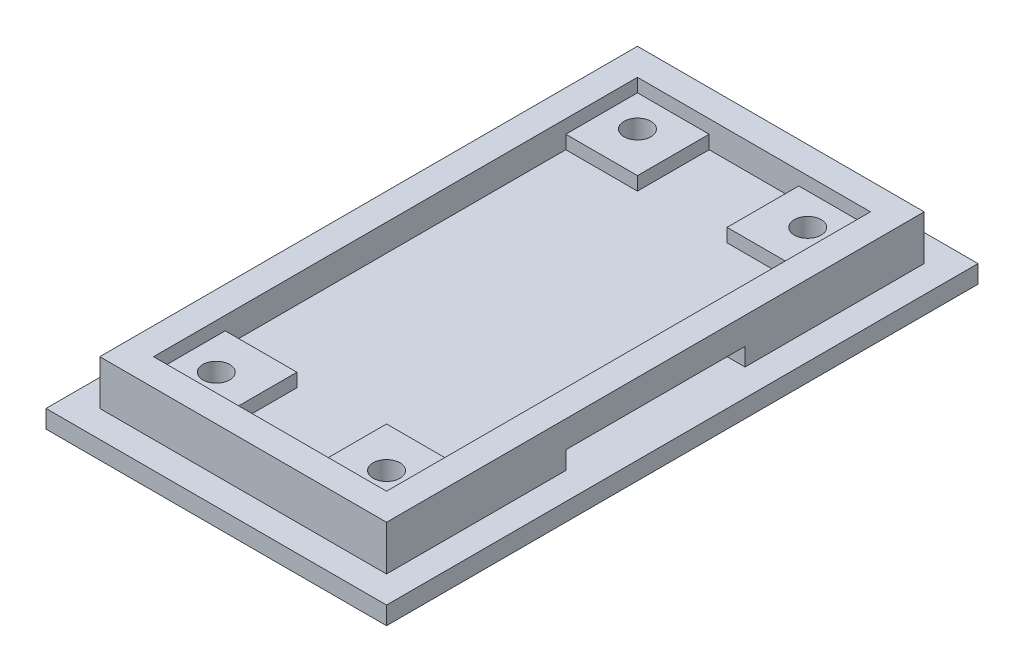
ISO-10303-21;
HEADER;
FILE_DESCRIPTION(('STEP AP214'),'2;1');
FILE_NAME('part.step','',(''),(''),'','','');
FILE_SCHEMA(('AUTOMOTIVE_DESIGN { 1 0 10303 214 1 1 1 1 }'));
ENDSEC;
DATA;
#1=APPLICATION_CONTEXT('core data for automotive mechanical design processes');
#2=APPLICATION_PROTOCOL_DEFINITION('international standard','automotive_design',2000,#1);
#3=PRODUCT_CONTEXT('',#1,'mechanical');
#4=PRODUCT('Part','Part','',(#3));
#5=PRODUCT_RELATED_PRODUCT_CATEGORY('part','',(#4));
#6=PRODUCT_DEFINITION_FORMATION('','',#4);
#7=PRODUCT_DEFINITION_CONTEXT('part definition',#1,'design');
#8=PRODUCT_DEFINITION('design','',#6,#7);
#9=PRODUCT_DEFINITION_SHAPE('','',#8);
#10=(LENGTH_UNIT() NAMED_UNIT(*) SI_UNIT(.MILLI.,.METRE.));
#11=(NAMED_UNIT(*) PLANE_ANGLE_UNIT() SI_UNIT($,.RADIAN.));
#12=(NAMED_UNIT(*) SI_UNIT($,.STERADIAN.) SOLID_ANGLE_UNIT());
#13=UNCERTAINTY_MEASURE_WITH_UNIT(LENGTH_MEASURE(1.E-05),#10,'distance_accuracy_value','');
#14=(GEOMETRIC_REPRESENTATION_CONTEXT(3) GLOBAL_UNCERTAINTY_ASSIGNED_CONTEXT((#13)) GLOBAL_UNIT_ASSIGNED_CONTEXT((#10,
#11,#12)) REPRESENTATION_CONTEXT('',''));
#15=CARTESIAN_POINT('',(0.,0.,0.));
#16=DIRECTION('',(0.,0.,1.));
#17=DIRECTION('',(1.,0.,0.));
#18=AXIS2_PLACEMENT_3D('',#15,#16,#17);
#19=CARTESIAN_POINT('',(0.,2.,0.));
#20=DIRECTION('',(0.,1.,0.));
#21=DIRECTION('',(0.,0.,1.));
#22=AXIS2_PLACEMENT_3D('',#19,#20,#21);
#23=PLANE('',#22);
#24=DIRECTION('',(-1.,0.,0.));
#25=VECTOR('',#24,1.);
#26=CARTESIAN_POINT('',(-4.99999999999821,2.,19.));
#27=LINE('',#26,#25);
#28=CARTESIAN_POINT('',(-4.99999999999821,2.,19.));
#29=VERTEX_POINT('',#28);
#30=CARTESIAN_POINT('',(-12.9999999999982,2.,19.));
#31=VERTEX_POINT('',#30);
#32=EDGE_CURVE('E305',#29,#31,#27,.T.);
#33=ORIENTED_EDGE('',*,*,#32,.F.);
#34=DIRECTION('',(0.,0.,-1.));
#35=VECTOR('',#34,1.);
#36=CARTESIAN_POINT('',(-4.99999999999821,2.,27.));
#37=LINE('',#36,#35);
#38=CARTESIAN_POINT('',(-4.99999999999821,2.,27.));
#39=VERTEX_POINT('',#38);
#40=EDGE_CURVE('E300',#39,#29,#37,.T.);
#41=ORIENTED_EDGE('',*,*,#40,.F.);
#42=DIRECTION('',(1.,0.,0.));
#43=VECTOR('',#42,1.);
#44=CARTESIAN_POINT('',(-13.,2.,27.));
#45=LINE('',#44,#43);
#46=CARTESIAN_POINT('',(5.00000000000179,2.,27.));
#47=VERTEX_POINT('',#46);
#48=EDGE_CURVE('E447',#39,#47,#45,.T.);
#49=ORIENTED_EDGE('',*,*,#48,.T.);
#50=DIRECTION('',(0.,0.,1.));
#51=VECTOR('',#50,1.);
#52=CARTESIAN_POINT('',(5.00000000000179,2.,27.));
#53=LINE('',#52,#51);
#54=CARTESIAN_POINT('',(5.00000000000179,2.,19.));
#55=VERTEX_POINT('',#54);
#56=EDGE_CURVE('E324',#55,#47,#53,.T.);
#57=ORIENTED_EDGE('',*,*,#56,.F.);
#58=DIRECTION('',(-1.,0.,0.));
#59=VECTOR('',#58,1.);
#60=CARTESIAN_POINT('',(13.0000000000018,2.,19.));
#61=LINE('',#60,#59);
#62=CARTESIAN_POINT('',(13.0000000000018,2.,19.));
#63=VERTEX_POINT('',#62);
#64=EDGE_CURVE('E319',#63,#55,#61,.T.);
#65=ORIENTED_EDGE('',*,*,#64,.F.);
#66=DIRECTION('',(0.,0.,-1.));
#67=VECTOR('',#66,1.);
#68=CARTESIAN_POINT('',(13.,2.,-27.));
#69=LINE('',#68,#67);
#70=CARTESIAN_POINT('',(13.,2.,-19.));
#71=VERTEX_POINT('',#70);
#72=EDGE_CURVE('E450',#63,#71,#69,.T.);
#73=ORIENTED_EDGE('',*,*,#72,.T.);
#74=DIRECTION('',(1.,0.,0.));
#75=VECTOR('',#74,1.);
#76=CARTESIAN_POINT('',(13.,2.,-19.));
#77=LINE('',#76,#75);
#78=CARTESIAN_POINT('',(5.,2.,-19.));
#79=VERTEX_POINT('',#78);
#80=EDGE_CURVE('E346',#79,#71,#77,.T.);
#81=ORIENTED_EDGE('',*,*,#80,.F.);
#82=DIRECTION('',(0.,0.,1.));
#83=VECTOR('',#82,1.);
#84=CARTESIAN_POINT('',(5.,2.,-19.));
#85=LINE('',#84,#83);
#86=CARTESIAN_POINT('',(5.,2.,-27.));
#87=VERTEX_POINT('',#86);
#88=EDGE_CURVE('E342',#87,#79,#85,.T.);
#89=ORIENTED_EDGE('',*,*,#88,.F.);
#90=DIRECTION('',(-1.,0.,0.));
#91=VECTOR('',#90,1.);
#92=CARTESIAN_POINT('',(-13.,2.,-27.));
#93=LINE('',#92,#91);
#94=CARTESIAN_POINT('',(-5.,2.,-27.));
#95=VERTEX_POINT('',#94);
#96=EDGE_CURVE('E452',#87,#95,#93,.T.);
#97=ORIENTED_EDGE('',*,*,#96,.T.);
#98=DIRECTION('',(0.,0.,-1.));
#99=VECTOR('',#98,1.);
#100=CARTESIAN_POINT('',(-5.,2.,-19.));
#101=LINE('',#100,#99);
#102=CARTESIAN_POINT('',(-5.,2.,-19.));
#103=VERTEX_POINT('',#102);
#104=EDGE_CURVE('E364',#103,#95,#101,.T.);
#105=ORIENTED_EDGE('',*,*,#104,.F.);
#106=DIRECTION('',(1.,0.,0.));
#107=VECTOR('',#106,1.);
#108=CARTESIAN_POINT('',(-5.,2.,-19.));
#109=LINE('',#108,#107);
#110=CARTESIAN_POINT('',(-13.,2.,-19.));
#111=VERTEX_POINT('',#110);
#112=EDGE_CURVE('E368',#111,#103,#109,.T.);
#113=ORIENTED_EDGE('',*,*,#112,.F.);
#114=DIRECTION('',(0.,0.,1.));
#115=VECTOR('',#114,1.);
#116=CARTESIAN_POINT('',(-13.,2.,-27.));
#117=LINE('',#116,#115);
#118=EDGE_CURVE('E444',#111,#31,#117,.T.);
#119=ORIENTED_EDGE('',*,*,#118,.T.);
#120=EDGE_LOOP('',(#33,#41,#49,#57,#65,#73,#81,#89,#97,#105,#113,#119));
#121=FACE_BOUND('',#120,.T.);
#122=ADVANCED_FACE('F32',(#121),#23,.T.);
#123=CARTESIAN_POINT('',(-13.,2.,27.));
#124=DIRECTION('',(0.,0.,1.));
#125=DIRECTION('',(1.,0.,0.));
#126=AXIS2_PLACEMENT_3D('',#123,#124,#125);
#127=PLANE('',#126);
#128=DIRECTION('',(0.,-1.,0.));
#129=VECTOR('',#128,1.);
#130=CARTESIAN_POINT('',(-4.99999999999821,3.5,27.));
#131=LINE('',#130,#129);
#132=CARTESIAN_POINT('',(-4.99999999999821,3.5,27.));
#133=VERTEX_POINT('',#132);
#134=EDGE_CURVE('E311',#133,#39,#131,.T.);
#135=ORIENTED_EDGE('',*,*,#134,.F.);
#136=DIRECTION('',(1.,0.,0.));
#137=VECTOR('',#136,1.);
#138=CARTESIAN_POINT('',(-4.99999999999821,3.5,27.));
#139=LINE('',#138,#137);
#140=CARTESIAN_POINT('',(-12.9999999999982,3.5,27.));
#141=VERTEX_POINT('',#140);
#142=EDGE_CURVE('E309',#141,#133,#139,.T.);
#143=ORIENTED_EDGE('',*,*,#142,.F.);
#144=DIRECTION('',(0.,1.,0.));
#145=VECTOR('',#144,1.);
#146=CARTESIAN_POINT('',(-13.,2.,27.));
#147=LINE('',#146,#145);
#148=CARTESIAN_POINT('',(-13.,5.,27.));
#149=VERTEX_POINT('',#148);
#150=EDGE_CURVE('E454',#141,#149,#147,.T.);
#151=ORIENTED_EDGE('',*,*,#150,.T.);
#152=DIRECTION('',(1.,0.,0.));
#153=VECTOR('',#152,1.);
#154=CARTESIAN_POINT('',(-13.,5.,27.));
#155=LINE('',#154,#153);
#156=CARTESIAN_POINT('',(13.,5.,27.));
#157=VERTEX_POINT('',#156);
#158=EDGE_CURVE('E457',#149,#157,#155,.T.);
#159=ORIENTED_EDGE('',*,*,#158,.T.);
#160=DIRECTION('',(0.,1.,0.));
#161=VECTOR('',#160,1.);
#162=CARTESIAN_POINT('',(13.,2.,27.));
#163=LINE('',#162,#161);
#164=CARTESIAN_POINT('',(13.0000000000018,3.5,27.));
#165=VERTEX_POINT('',#164);
#166=EDGE_CURVE('E470',#165,#157,#163,.T.);
#167=ORIENTED_EDGE('',*,*,#166,.F.);
#168=DIRECTION('',(1.,0.,0.));
#169=VECTOR('',#168,1.);
#170=CARTESIAN_POINT('',(13.0000000000018,3.5,27.));
#171=LINE('',#170,#169);
#172=CARTESIAN_POINT('',(5.00000000000179,3.5,27.));
#173=VERTEX_POINT('',#172);
#174=EDGE_CURVE('E329',#173,#165,#171,.T.);
#175=ORIENTED_EDGE('',*,*,#174,.F.);
#176=DIRECTION('',(0.,-1.,0.));
#177=VECTOR('',#176,1.);
#178=CARTESIAN_POINT('',(5.00000000000179,3.5,27.));
#179=LINE('',#178,#177);
#180=EDGE_CURVE('E331',#173,#47,#179,.T.);
#181=ORIENTED_EDGE('',*,*,#180,.T.);
#182=ORIENTED_EDGE('',*,*,#48,.F.);
#183=EDGE_LOOP('',(#135,#143,#151,#159,#167,#175,#181,#182));
#184=FACE_BOUND('',#183,.T.);
#185=ADVANCED_FACE('F547',(#184),#127,.F.);
#186=CARTESIAN_POINT('',(-13.,2.,-27.));
#187=DIRECTION('',(-1.,0.,0.));
#188=DIRECTION('',(0.,0.,1.));
#189=AXIS2_PLACEMENT_3D('',#186,#187,#188);
#190=PLANE('',#189);
#191=DIRECTION('',(0.,-1.,0.));
#192=VECTOR('',#191,1.);
#193=CARTESIAN_POINT('',(-12.9999999999982,3.5,19.));
#194=LINE('',#193,#192);
#195=CARTESIAN_POINT('',(-13.,3.5,19.));
#196=VERTEX_POINT('',#195);
#197=EDGE_CURVE('E55',#196,#31,#194,.T.);
#198=ORIENTED_EDGE('',*,*,#197,.T.);
#199=ORIENTED_EDGE('',*,*,#118,.F.);
#200=DIRECTION('',(0.,-1.,0.));
#201=VECTOR('',#200,1.);
#202=CARTESIAN_POINT('',(-13.,3.5,-19.));
#203=LINE('',#202,#201);
#204=CARTESIAN_POINT('',(-13.,3.5,-19.));
#205=VERTEX_POINT('',#204);
#206=EDGE_CURVE('E380',#205,#111,#203,.T.);
#207=ORIENTED_EDGE('',*,*,#206,.F.);
#208=DIRECTION('',(0.,0.,1.));
#209=VECTOR('',#208,1.);
#210=CARTESIAN_POINT('',(-13.,3.5,-19.));
#211=LINE('',#210,#209);
#212=CARTESIAN_POINT('',(-13.,3.5,-27.));
#213=VERTEX_POINT('',#212);
#214=EDGE_CURVE('E370',#213,#205,#211,.T.);
#215=ORIENTED_EDGE('',*,*,#214,.F.);
#216=DIRECTION('',(0.,1.,0.));
#217=VECTOR('',#216,1.);
#218=CARTESIAN_POINT('',(-13.,2.,-27.));
#219=LINE('',#218,#217);
#220=CARTESIAN_POINT('',(-13.,5.,-27.));
#221=VERTEX_POINT('',#220);
#222=EDGE_CURVE('E465',#213,#221,#219,.T.);
#223=ORIENTED_EDGE('',*,*,#222,.T.);
#224=DIRECTION('',(0.,0.,1.));
#225=VECTOR('',#224,1.);
#226=CARTESIAN_POINT('',(-13.,5.,-27.));
#227=LINE('',#226,#225);
#228=EDGE_CURVE('E443',#221,#149,#227,.T.);
#229=ORIENTED_EDGE('',*,*,#228,.T.);
#230=ORIENTED_EDGE('',*,*,#150,.F.);
#231=DIRECTION('',(0.,0.,1.));
#232=VECTOR('',#231,1.);
#233=CARTESIAN_POINT('',(-12.9999999999982,3.5,27.));
#234=LINE('',#233,#232);
#235=EDGE_CURVE('E307',#196,#141,#234,.T.);
#236=ORIENTED_EDGE('',*,*,#235,.F.);
#237=EDGE_LOOP('',(#198,#199,#207,#215,#223,#229,#230,#236));
#238=FACE_BOUND('',#237,.T.);
#239=ADVANCED_FACE('F553',(#238),#190,.F.);
#240=CARTESIAN_POINT('',(13.,2.,-27.));
#241=DIRECTION('',(1.,0.,0.));
#242=DIRECTION('',(0.,0.,-1.));
#243=AXIS2_PLACEMENT_3D('',#240,#241,#242);
#244=PLANE('',#243);
#245=DIRECTION('',(0.,-1.,0.));
#246=VECTOR('',#245,1.);
#247=CARTESIAN_POINT('',(13.0000000000018,3.5,19.));
#248=LINE('',#247,#246);
#249=CARTESIAN_POINT('',(13.0000000000018,3.5,19.));
#250=VERTEX_POINT('',#249);
#251=EDGE_CURVE('E340',#250,#63,#248,.T.);
#252=ORIENTED_EDGE('',*,*,#251,.F.);
#253=DIRECTION('',(0.,0.,-1.));
#254=VECTOR('',#253,1.);
#255=CARTESIAN_POINT('',(13.0000000000018,3.5,27.));
#256=LINE('',#255,#254);
#257=EDGE_CURVE('E320',#165,#250,#256,.T.);
#258=ORIENTED_EDGE('',*,*,#257,.F.);
#259=ORIENTED_EDGE('',*,*,#166,.T.);
#260=DIRECTION('',(0.,0.,-1.));
#261=VECTOR('',#260,1.);
#262=CARTESIAN_POINT('',(13.,5.,-27.));
#263=LINE('',#262,#261);
#264=CARTESIAN_POINT('',(13.,5.,-27.));
#265=VERTEX_POINT('',#264);
#266=EDGE_CURVE('E460',#157,#265,#263,.T.);
#267=ORIENTED_EDGE('',*,*,#266,.T.);
#268=DIRECTION('',(0.,1.,0.));
#269=VECTOR('',#268,1.);
#270=CARTESIAN_POINT('',(13.,2.,-27.));
#271=LINE('',#270,#269);
#272=CARTESIAN_POINT('',(13.,3.5,-27.));
#273=VERTEX_POINT('',#272);
#274=EDGE_CURVE('E468',#273,#265,#271,.T.);
#275=ORIENTED_EDGE('',*,*,#274,.F.);
#276=DIRECTION('',(0.,0.,-1.));
#277=VECTOR('',#276,1.);
#278=CARTESIAN_POINT('',(13.,3.5,-19.));
#279=LINE('',#278,#277);
#280=CARTESIAN_POINT('',(13.,3.5,-19.));
#281=VERTEX_POINT('',#280);
#282=EDGE_CURVE('E343',#281,#273,#279,.T.);
#283=ORIENTED_EDGE('',*,*,#282,.F.);
#284=DIRECTION('',(0.,-1.,0.));
#285=VECTOR('',#284,1.);
#286=CARTESIAN_POINT('',(13.,3.5,-19.));
#287=LINE('',#286,#285);
#288=EDGE_CURVE('E353',#281,#71,#287,.T.);
#289=ORIENTED_EDGE('',*,*,#288,.T.);
#290=ORIENTED_EDGE('',*,*,#72,.F.);
#291=EDGE_LOOP('',(#252,#258,#259,#267,#275,#283,#289,#290));
#292=FACE_BOUND('',#291,.T.);
#293=ADVANCED_FACE('F563',(#292),#244,.F.);
#294=CARTESIAN_POINT('',(-13.,2.,-27.));
#295=DIRECTION('',(0.,0.,-1.));
#296=DIRECTION('',(-1.,0.,0.));
#297=AXIS2_PLACEMENT_3D('',#294,#295,#296);
#298=PLANE('',#297);
#299=DIRECTION('',(0.,-1.,0.));
#300=VECTOR('',#299,1.);
#301=CARTESIAN_POINT('',(5.,3.5,-27.));
#302=LINE('',#301,#300);
#303=CARTESIAN_POINT('',(5.,3.5,-27.));
#304=VERTEX_POINT('',#303);
#305=EDGE_CURVE('E362',#304,#87,#302,.T.);
#306=ORIENTED_EDGE('',*,*,#305,.F.);
#307=DIRECTION('',(-1.,0.,0.));
#308=VECTOR('',#307,1.);
#309=CARTESIAN_POINT('',(13.,3.5,-27.));
#310=LINE('',#309,#308);
#311=EDGE_CURVE('E345',#273,#304,#310,.T.);
#312=ORIENTED_EDGE('',*,*,#311,.F.);
#313=ORIENTED_EDGE('',*,*,#274,.T.);
#314=DIRECTION('',(-1.,0.,0.));
#315=VECTOR('',#314,1.);
#316=CARTESIAN_POINT('',(-13.,5.,-27.));
#317=LINE('',#316,#315);
#318=EDGE_CURVE('E448',#265,#221,#317,.T.);
#319=ORIENTED_EDGE('',*,*,#318,.T.);
#320=ORIENTED_EDGE('',*,*,#222,.F.);
#321=DIRECTION('',(-1.,0.,0.));
#322=VECTOR('',#321,1.);
#323=CARTESIAN_POINT('',(-5.,3.5,-27.));
#324=LINE('',#323,#322);
#325=CARTESIAN_POINT('',(-5.,3.5,-27.));
#326=VERTEX_POINT('',#325);
#327=EDGE_CURVE('E367',#326,#213,#324,.T.);
#328=ORIENTED_EDGE('',*,*,#327,.F.);
#329=DIRECTION('',(0.,-1.,0.));
#330=VECTOR('',#329,1.);
#331=CARTESIAN_POINT('',(-5.,3.5,-27.));
#332=LINE('',#331,#330);
#333=EDGE_CURVE('E382',#326,#95,#332,.T.);
#334=ORIENTED_EDGE('',*,*,#333,.T.);
#335=ORIENTED_EDGE('',*,*,#96,.F.);
#336=EDGE_LOOP('',(#306,#312,#313,#319,#320,#328,#334,#335));
#337=FACE_BOUND('',#336,.T.);
#338=ADVANCED_FACE('F560',(#337),#298,.F.);
#339=CARTESIAN_POINT('',(16.,5.,-30.));
#340=DIRECTION('',(-1.,0.,0.));
#341=DIRECTION('',(0.,0.,1.));
#342=AXIS2_PLACEMENT_3D('',#339,#340,#341);
#343=PLANE('',#342);
#344=DIRECTION('',(0.,-1.,0.));
#345=VECTOR('',#344,1.);
#346=CARTESIAN_POINT('',(16.,0.,-10.));
#347=LINE('',#346,#345);
#348=CARTESIAN_POINT('',(16.,2.,-10.));
#349=VERTEX_POINT('',#348);
#350=CARTESIAN_POINT('',(16.,0.,-10.));
#351=VERTEX_POINT('',#350);
#352=EDGE_CURVE('E415',#349,#351,#347,.T.);
#353=ORIENTED_EDGE('',*,*,#352,.T.);
#354=DIRECTION('',(0.,0.,-1.));
#355=VECTOR('',#354,1.);
#356=CARTESIAN_POINT('',(16.,0.,-30.));
#357=LINE('',#356,#355);
#358=CARTESIAN_POINT('',(16.,0.,-30.));
#359=VERTEX_POINT('',#358);
#360=EDGE_CURVE('E489',#351,#359,#357,.T.);
#361=ORIENTED_EDGE('',*,*,#360,.T.);
#362=DIRECTION('',(0.,-1.,0.));
#363=VECTOR('',#362,1.);
#364=CARTESIAN_POINT('',(16.,5.,-30.));
#365=LINE('',#364,#363);
#366=CARTESIAN_POINT('',(16.,5.,-30.));
#367=VERTEX_POINT('',#366);
#368=EDGE_CURVE('E496',#367,#359,#365,.T.);
#369=ORIENTED_EDGE('',*,*,#368,.F.);
#370=DIRECTION('',(0.,0.,-1.));
#371=VECTOR('',#370,1.);
#372=CARTESIAN_POINT('',(16.,5.,-30.));
#373=LINE('',#372,#371);
#374=CARTESIAN_POINT('',(16.,5.,30.));
#375=VERTEX_POINT('',#374);
#376=EDGE_CURVE('E479',#375,#367,#373,.T.);
#377=ORIENTED_EDGE('',*,*,#376,.F.);
#378=DIRECTION('',(0.,-1.,0.));
#379=VECTOR('',#378,1.);
#380=CARTESIAN_POINT('',(16.,5.,30.));
#381=LINE('',#380,#379);
#382=CARTESIAN_POINT('',(16.,0.,30.));
#383=VERTEX_POINT('',#382);
#384=EDGE_CURVE('E40',#375,#383,#381,.T.);
#385=ORIENTED_EDGE('',*,*,#384,.T.);
#386=CARTESIAN_POINT('',(16.,0.,10.));
#387=VERTEX_POINT('',#386);
#388=EDGE_CURVE('E490',#383,#387,#357,.T.);
#389=ORIENTED_EDGE('',*,*,#388,.T.);
#390=DIRECTION('',(0.,1.,0.));
#391=VECTOR('',#390,1.);
#392=CARTESIAN_POINT('',(16.,0.,10.));
#393=LINE('',#392,#391);
#394=CARTESIAN_POINT('',(16.,2.,10.));
#395=VERTEX_POINT('',#394);
#396=EDGE_CURVE('E430',#387,#395,#393,.T.);
#397=ORIENTED_EDGE('',*,*,#396,.T.);
#398=DIRECTION('',(0.,0.,-1.));
#399=VECTOR('',#398,1.);
#400=CARTESIAN_POINT('',(16.,2.,-10.));
#401=LINE('',#400,#399);
#402=EDGE_CURVE('E420',#395,#349,#401,.T.);
#403=ORIENTED_EDGE('',*,*,#402,.T.);
#404=EDGE_LOOP('',(#353,#361,#369,#377,#385,#389,#397,#403));
#405=FACE_BOUND('',#404,.T.);
#406=ADVANCED_FACE('F503',(#405),#343,.F.);
#407=CARTESIAN_POINT('',(-16.,5.,-30.));
#408=DIRECTION('',(1.,0.,0.));
#409=DIRECTION('',(0.,0.,-1.));
#410=AXIS2_PLACEMENT_3D('',#407,#408,#409);
#411=PLANE('',#410);
#412=DIRECTION('',(0.,0.,1.));
#413=VECTOR('',#412,1.);
#414=CARTESIAN_POINT('',(-16.,0.,-30.));
#415=LINE('',#414,#413);
#416=CARTESIAN_POINT('',(-16.,0.,-30.));
#417=VERTEX_POINT('',#416);
#418=CARTESIAN_POINT('',(-16.,0.,-10.));
#419=VERTEX_POINT('',#418);
#420=EDGE_CURVE('E484',#417,#419,#415,.T.);
#421=ORIENTED_EDGE('',*,*,#420,.T.);
#422=DIRECTION('',(0.,-1.,0.));
#423=VECTOR('',#422,1.);
#424=CARTESIAN_POINT('',(-16.,0.,-10.));
#425=LINE('',#424,#423);
#426=CARTESIAN_POINT('',(-16.,2.,-10.));
#427=VERTEX_POINT('',#426);
#428=EDGE_CURVE('E47',#427,#419,#425,.T.);
#429=ORIENTED_EDGE('',*,*,#428,.F.);
#430=DIRECTION('',(0.,0.,-1.));
#431=VECTOR('',#430,1.);
#432=CARTESIAN_POINT('',(-16.,2.,-10.));
#433=LINE('',#432,#431);
#434=CARTESIAN_POINT('',(-16.,2.,10.));
#435=VERTEX_POINT('',#434);
#436=EDGE_CURVE('E248',#435,#427,#433,.T.);
#437=ORIENTED_EDGE('',*,*,#436,.F.);
#438=DIRECTION('',(0.,1.,0.));
#439=VECTOR('',#438,1.);
#440=CARTESIAN_POINT('',(-16.,0.,10.));
#441=LINE('',#440,#439);
#442=CARTESIAN_POINT('',(-16.,0.,10.));
#443=VERTEX_POINT('',#442);
#444=EDGE_CURVE('E259',#443,#435,#441,.T.);
#445=ORIENTED_EDGE('',*,*,#444,.F.);
#446=CARTESIAN_POINT('',(-16.,0.,30.));
#447=VERTEX_POINT('',#446);
#448=EDGE_CURVE('E467',#443,#447,#415,.T.);
#449=ORIENTED_EDGE('',*,*,#448,.T.);
#450=DIRECTION('',(0.,-1.,0.));
#451=VECTOR('',#450,1.);
#452=CARTESIAN_POINT('',(-16.,5.,30.));
#453=LINE('',#452,#451);
#454=CARTESIAN_POINT('',(-16.,5.,30.));
#455=VERTEX_POINT('',#454);
#456=EDGE_CURVE('E11',#455,#447,#453,.T.);
#457=ORIENTED_EDGE('',*,*,#456,.F.);
#458=DIRECTION('',(0.,0.,1.));
#459=VECTOR('',#458,1.);
#460=CARTESIAN_POINT('',(-16.,5.,-30.));
#461=LINE('',#460,#459);
#462=CARTESIAN_POINT('',(-16.,5.,-30.));
#463=VERTEX_POINT('',#462);
#464=EDGE_CURVE('E473',#463,#455,#461,.T.);
#465=ORIENTED_EDGE('',*,*,#464,.F.);
#466=DIRECTION('',(0.,-1.,0.));
#467=VECTOR('',#466,1.);
#468=CARTESIAN_POINT('',(-16.,5.,-30.));
#469=LINE('',#468,#467);
#470=EDGE_CURVE('E483',#463,#417,#469,.T.);
#471=ORIENTED_EDGE('',*,*,#470,.T.);
#472=EDGE_LOOP('',(#421,#429,#437,#445,#449,#457,#465,#471));
#473=FACE_BOUND('',#472,.T.);
#474=ADVANCED_FACE('F34',(#473),#411,.F.);
#475=CARTESIAN_POINT('',(-16.,5.,30.));
#476=DIRECTION('',(0.,0.,-1.));
#477=DIRECTION('',(-1.,0.,0.));
#478=AXIS2_PLACEMENT_3D('',#475,#476,#477);
#479=PLANE('',#478);
#480=DIRECTION('',(1.,0.,0.));
#481=VECTOR('',#480,1.);
#482=CARTESIAN_POINT('',(-16.,0.,30.));
#483=LINE('',#482,#481);
#484=EDGE_CURVE('E487',#447,#383,#483,.T.);
#485=ORIENTED_EDGE('',*,*,#484,.T.);
#486=ORIENTED_EDGE('',*,*,#384,.F.);
#487=DIRECTION('',(1.,0.,0.));
#488=VECTOR('',#487,1.);
#489=CARTESIAN_POINT('',(-16.,5.,30.));
#490=LINE('',#489,#488);
#491=EDGE_CURVE('E476',#455,#375,#490,.T.);
#492=ORIENTED_EDGE('',*,*,#491,.F.);
#493=ORIENTED_EDGE('',*,*,#456,.T.);
#494=EDGE_LOOP('',(#485,#486,#492,#493));
#495=FACE_BOUND('',#494,.T.);
#496=ADVANCED_FACE('F538',(#495),#479,.F.);
#497=CARTESIAN_POINT('',(-16.,5.,-30.));
#498=DIRECTION('',(0.,0.,1.));
#499=DIRECTION('',(1.,0.,0.));
#500=AXIS2_PLACEMENT_3D('',#497,#498,#499);
#501=PLANE('',#500);
#502=DIRECTION('',(-1.,0.,0.));
#503=VECTOR('',#502,1.);
#504=CARTESIAN_POINT('',(-16.,0.,-30.));
#505=LINE('',#504,#503);
#506=EDGE_CURVE('E477',#359,#417,#505,.T.);
#507=ORIENTED_EDGE('',*,*,#506,.T.);
#508=ORIENTED_EDGE('',*,*,#470,.F.);
#509=DIRECTION('',(-1.,0.,0.));
#510=VECTOR('',#509,1.);
#511=CARTESIAN_POINT('',(-16.,5.,-30.));
#512=LINE('',#511,#510);
#513=EDGE_CURVE('E481',#367,#463,#512,.T.);
#514=ORIENTED_EDGE('',*,*,#513,.F.);
#515=ORIENTED_EDGE('',*,*,#368,.T.);
#516=EDGE_LOOP('',(#507,#508,#514,#515));
#517=FACE_BOUND('',#516,.T.);
#518=ADVANCED_FACE('F531',(#517),#501,.F.);
#519=CARTESIAN_POINT('',(0.,5.,0.));
#520=DIRECTION('',(0.,1.,0.));
#521=DIRECTION('',(0.,0.,1.));
#522=AXIS2_PLACEMENT_3D('',#519,#520,#521);
#523=PLANE('',#522);
#524=ORIENTED_EDGE('',*,*,#228,.F.);
#525=ORIENTED_EDGE('',*,*,#318,.F.);
#526=ORIENTED_EDGE('',*,*,#266,.F.);
#527=ORIENTED_EDGE('',*,*,#158,.F.);
#528=EDGE_LOOP('',(#524,#525,#526,#527));
#529=FACE_BOUND('',#528,.T.);
#530=ORIENTED_EDGE('',*,*,#464,.T.);
#531=ORIENTED_EDGE('',*,*,#491,.T.);
#532=ORIENTED_EDGE('',*,*,#376,.T.);
#533=ORIENTED_EDGE('',*,*,#513,.T.);
#534=EDGE_LOOP('',(#530,#531,#532,#533));
#535=FACE_BOUND('',#534,.T.);
#536=ADVANCED_FACE('F537',(#529,#535),#523,.T.);
#537=CARTESIAN_POINT('',(14.,0.,-10.));
#538=DIRECTION('',(0.,0.,1.));
#539=DIRECTION('',(0.,-1.,0.));
#540=AXIS2_PLACEMENT_3D('',#537,#538,#539);
#541=PLANE('',#540);
#542=ORIENTED_EDGE('',*,*,#352,.F.);
#543=DIRECTION('',(1.,0.,0.));
#544=VECTOR('',#543,1.);
#545=CARTESIAN_POINT('',(14.,2.,-10.));
#546=LINE('',#545,#544);
#547=CARTESIAN_POINT('',(14.,2.,-10.));
#548=VERTEX_POINT('',#547);
#549=EDGE_CURVE('E427',#548,#349,#546,.T.);
#550=ORIENTED_EDGE('',*,*,#549,.F.);
#551=DIRECTION('',(0.,-1.,0.));
#552=VECTOR('',#551,1.);
#553=CARTESIAN_POINT('',(14.,0.,-10.));
#554=LINE('',#553,#552);
#555=CARTESIAN_POINT('',(14.,0.,-10.));
#556=VERTEX_POINT('',#555);
#557=EDGE_CURVE('E416',#548,#556,#554,.T.);
#558=ORIENTED_EDGE('',*,*,#557,.T.);
#559=DIRECTION('',(1.,0.,0.));
#560=VECTOR('',#559,1.);
#561=CARTESIAN_POINT('',(14.,0.,-10.));
#562=LINE('',#561,#560);
#563=EDGE_CURVE('E441',#556,#351,#562,.T.);
#564=ORIENTED_EDGE('',*,*,#563,.T.);
#565=EDGE_LOOP('',(#542,#550,#558,#564));
#566=FACE_BOUND('',#565,.T.);
#567=ADVANCED_FACE('F525',(#566),#541,.T.);
#568=CARTESIAN_POINT('',(14.,0.,10.));
#569=DIRECTION('',(0.,0.,-1.));
#570=DIRECTION('',(-1.,0.,0.));
#571=AXIS2_PLACEMENT_3D('',#568,#569,#570);
#572=PLANE('',#571);
#573=ORIENTED_EDGE('',*,*,#396,.F.);
#574=DIRECTION('',(1.,0.,0.));
#575=VECTOR('',#574,1.);
#576=CARTESIAN_POINT('',(14.,0.,10.));
#577=LINE('',#576,#575);
#578=CARTESIAN_POINT('',(14.,0.,10.));
#579=VERTEX_POINT('',#578);
#580=EDGE_CURVE('E438',#579,#387,#577,.T.);
#581=ORIENTED_EDGE('',*,*,#580,.F.);
#582=DIRECTION('',(0.,1.,0.));
#583=VECTOR('',#582,1.);
#584=CARTESIAN_POINT('',(14.,0.,10.));
#585=LINE('',#584,#583);
#586=CARTESIAN_POINT('',(14.,2.,10.));
#587=VERTEX_POINT('',#586);
#588=EDGE_CURVE('E423',#579,#587,#585,.T.);
#589=ORIENTED_EDGE('',*,*,#588,.T.);
#590=DIRECTION('',(1.,0.,0.));
#591=VECTOR('',#590,1.);
#592=CARTESIAN_POINT('',(14.,2.,10.));
#593=LINE('',#592,#591);
#594=EDGE_CURVE('E436',#587,#395,#593,.T.);
#595=ORIENTED_EDGE('',*,*,#594,.T.);
#596=EDGE_LOOP('',(#573,#581,#589,#595));
#597=FACE_BOUND('',#596,.T.);
#598=ADVANCED_FACE('F513',(#597),#572,.T.);
#599=CARTESIAN_POINT('',(14.,2.,-10.));
#600=DIRECTION('',(0.,-1.,0.));
#601=DIRECTION('',(0.,0.,-1.));
#602=AXIS2_PLACEMENT_3D('',#599,#600,#601);
#603=PLANE('',#602);
#604=ORIENTED_EDGE('',*,*,#402,.F.);
#605=ORIENTED_EDGE('',*,*,#594,.F.);
#606=DIRECTION('',(0.,0.,-1.));
#607=VECTOR('',#606,1.);
#608=CARTESIAN_POINT('',(14.,2.,-10.));
#609=LINE('',#608,#607);
#610=EDGE_CURVE('E425',#587,#548,#609,.T.);
#611=ORIENTED_EDGE('',*,*,#610,.T.);
#612=ORIENTED_EDGE('',*,*,#549,.T.);
#613=EDGE_LOOP('',(#604,#605,#611,#612));
#614=FACE_BOUND('',#613,.T.);
#615=ADVANCED_FACE('F522',(#614),#603,.T.);
#616=CARTESIAN_POINT('',(14.,0.,0.));
#617=DIRECTION('',(1.,0.,0.));
#618=DIRECTION('',(0.,0.,-1.));
#619=AXIS2_PLACEMENT_3D('',#616,#617,#618);
#620=PLANE('',#619);
#621=ORIENTED_EDGE('',*,*,#557,.F.);
#622=ORIENTED_EDGE('',*,*,#610,.F.);
#623=ORIENTED_EDGE('',*,*,#588,.F.);
#624=DIRECTION('',(0.,0.,1.));
#625=VECTOR('',#624,1.);
#626=CARTESIAN_POINT('',(14.,0.,-10.));
#627=LINE('',#626,#625);
#628=EDGE_CURVE('E419',#556,#579,#627,.T.);
#629=ORIENTED_EDGE('',*,*,#628,.F.);
#630=EDGE_LOOP('',(#621,#622,#623,#629));
#631=FACE_BOUND('',#630,.T.);
#632=ADVANCED_FACE('F518',(#631),#620,.T.);
#633=CARTESIAN_POINT('',(0.,0.,0.));
#634=DIRECTION('',(0.,-1.,0.));
#635=DIRECTION('',(0.,0.,-1.));
#636=AXIS2_PLACEMENT_3D('',#633,#634,#635);
#637=PLANE('',#636);
#638=DIRECTION('',(0.,0.,-1.));
#639=VECTOR('',#638,1.);
#640=CARTESIAN_POINT('',(-19.,0.,33.));
#641=LINE('',#640,#639);
#642=CARTESIAN_POINT('',(-19.,0.,33.));
#643=VERTEX_POINT('',#642);
#644=CARTESIAN_POINT('',(-19.,0.,-33.));
#645=VERTEX_POINT('',#644);
#646=EDGE_CURVE('E385',#643,#645,#641,.T.);
#647=ORIENTED_EDGE('',*,*,#646,.F.);
#648=DIRECTION('',(-1.,0.,0.));
#649=VECTOR('',#648,1.);
#650=CARTESIAN_POINT('',(-19.,0.,33.));
#651=LINE('',#650,#649);
#652=CARTESIAN_POINT('',(19.,0.,33.));
#653=VERTEX_POINT('',#652);
#654=EDGE_CURVE('E390',#653,#643,#651,.T.);
#655=ORIENTED_EDGE('',*,*,#654,.F.);
#656=DIRECTION('',(0.,0.,1.));
#657=VECTOR('',#656,1.);
#658=CARTESIAN_POINT('',(19.,0.,33.));
#659=LINE('',#658,#657);
#660=CARTESIAN_POINT('',(19.,0.,-33.));
#661=VERTEX_POINT('',#660);
#662=EDGE_CURVE('E401',#661,#653,#659,.T.);
#663=ORIENTED_EDGE('',*,*,#662,.F.);
#664=DIRECTION('',(1.,0.,0.));
#665=VECTOR('',#664,1.);
#666=CARTESIAN_POINT('',(-19.,0.,-33.));
#667=LINE('',#666,#665);
#668=EDGE_CURVE('E399',#645,#661,#667,.T.);
#669=ORIENTED_EDGE('',*,*,#668,.F.);
#670=EDGE_LOOP('',(#647,#655,#663,#669));
#671=FACE_BOUND('',#670,.T.);
#672=ORIENTED_EDGE('',*,*,#484,.F.);
#673=ORIENTED_EDGE('',*,*,#448,.F.);
#674=DIRECTION('',(-1.,0.,0.));
#675=VECTOR('',#674,1.);
#676=CARTESIAN_POINT('',(-14.,0.,10.));
#677=LINE('',#676,#675);
#678=CARTESIAN_POINT('',(-14.,0.,10.));
#679=VERTEX_POINT('',#678);
#680=EDGE_CURVE('E274',#679,#443,#677,.T.);
#681=ORIENTED_EDGE('',*,*,#680,.F.);
#682=DIRECTION('',(0.,0.,1.));
#683=VECTOR('',#682,1.);
#684=CARTESIAN_POINT('',(-14.,0.,-10.));
#685=LINE('',#684,#683);
#686=CARTESIAN_POINT('',(-14.,0.,-10.));
#687=VERTEX_POINT('',#686);
#688=EDGE_CURVE('E265',#687,#679,#685,.T.);
#689=ORIENTED_EDGE('',*,*,#688,.F.);
#690=DIRECTION('',(-1.,0.,0.));
#691=VECTOR('',#690,1.);
#692=CARTESIAN_POINT('',(-14.,0.,-10.));
#693=LINE('',#692,#691);
#694=EDGE_CURVE('E255',#687,#419,#693,.T.);
#695=ORIENTED_EDGE('',*,*,#694,.T.);
#696=ORIENTED_EDGE('',*,*,#420,.F.);
#697=ORIENTED_EDGE('',*,*,#506,.F.);
#698=ORIENTED_EDGE('',*,*,#360,.F.);
#699=ORIENTED_EDGE('',*,*,#563,.F.);
#700=ORIENTED_EDGE('',*,*,#628,.T.);
#701=ORIENTED_EDGE('',*,*,#580,.T.);
#702=ORIENTED_EDGE('',*,*,#388,.F.);
#703=EDGE_LOOP('',(#672,#673,#681,#689,#695,#696,#697,#698,#699,#700,#701,#702));
#704=FACE_BOUND('',#703,.T.);
#705=ADVANCED_FACE('F508',(#671,#704),#637,.F.);
#706=CARTESIAN_POINT('',(-19.,-2.,33.));
#707=DIRECTION('',(1.,0.,0.));
#708=DIRECTION('',(0.,0.,-1.));
#709=AXIS2_PLACEMENT_3D('',#706,#707,#708);
#710=PLANE('',#709);
#711=ORIENTED_EDGE('',*,*,#646,.T.);
#712=DIRECTION('',(0.,1.,0.));
#713=VECTOR('',#712,1.);
#714=CARTESIAN_POINT('',(-19.,-2.,-33.));
#715=LINE('',#714,#713);
#716=CARTESIAN_POINT('',(-19.,-2.,-33.));
#717=VERTEX_POINT('',#716);
#718=EDGE_CURVE('E412',#717,#645,#715,.T.);
#719=ORIENTED_EDGE('',*,*,#718,.F.);
#720=DIRECTION('',(0.,0.,-1.));
#721=VECTOR('',#720,1.);
#722=CARTESIAN_POINT('',(-19.,-2.,33.));
#723=LINE('',#722,#721);
#724=CARTESIAN_POINT('',(-19.,-2.,33.));
#725=VERTEX_POINT('',#724);
#726=EDGE_CURVE('E386',#725,#717,#723,.T.);
#727=ORIENTED_EDGE('',*,*,#726,.F.);
#728=DIRECTION('',(0.,1.,0.));
#729=VECTOR('',#728,1.);
#730=CARTESIAN_POINT('',(-19.,-2.,33.));
#731=LINE('',#730,#729);
#732=EDGE_CURVE('E396',#725,#643,#731,.T.);
#733=ORIENTED_EDGE('',*,*,#732,.T.);
#734=EDGE_LOOP('',(#711,#719,#727,#733));
#735=FACE_BOUND('',#734,.T.);
#736=ADVANCED_FACE('F599',(#735),#710,.F.);
#737=CARTESIAN_POINT('',(-19.,-2.,-33.));
#738=DIRECTION('',(0.,0.,1.));
#739=DIRECTION('',(1.,0.,0.));
#740=AXIS2_PLACEMENT_3D('',#737,#738,#739);
#741=PLANE('',#740);
#742=ORIENTED_EDGE('',*,*,#668,.T.);
#743=DIRECTION('',(0.,1.,0.));
#744=VECTOR('',#743,1.);
#745=CARTESIAN_POINT('',(19.,-2.,-33.));
#746=LINE('',#745,#744);
#747=CARTESIAN_POINT('',(19.,-2.,-33.));
#748=VERTEX_POINT('',#747);
#749=EDGE_CURVE('E409',#748,#661,#746,.T.);
#750=ORIENTED_EDGE('',*,*,#749,.F.);
#751=DIRECTION('',(1.,0.,0.));
#752=VECTOR('',#751,1.);
#753=CARTESIAN_POINT('',(-19.,-2.,-33.));
#754=LINE('',#753,#752);
#755=EDGE_CURVE('E389',#717,#748,#754,.T.);
#756=ORIENTED_EDGE('',*,*,#755,.F.);
#757=ORIENTED_EDGE('',*,*,#718,.T.);
#758=EDGE_LOOP('',(#742,#750,#756,#757));
#759=FACE_BOUND('',#758,.T.);
#760=ADVANCED_FACE('F714',(#759),#741,.F.);
#761=CARTESIAN_POINT('',(19.,-2.,33.));
#762=DIRECTION('',(-1.,0.,0.));
#763=DIRECTION('',(0.,0.,1.));
#764=AXIS2_PLACEMENT_3D('',#761,#762,#763);
#765=PLANE('',#764);
#766=ORIENTED_EDGE('',*,*,#662,.T.);
#767=DIRECTION('',(0.,1.,0.));
#768=VECTOR('',#767,1.);
#769=CARTESIAN_POINT('',(19.,-2.,33.));
#770=LINE('',#769,#768);
#771=CARTESIAN_POINT('',(19.,-2.,33.));
#772=VERTEX_POINT('',#771);
#773=EDGE_CURVE('E406',#772,#653,#770,.T.);
#774=ORIENTED_EDGE('',*,*,#773,.F.);
#775=DIRECTION('',(0.,0.,1.));
#776=VECTOR('',#775,1.);
#777=CARTESIAN_POINT('',(19.,-2.,33.));
#778=LINE('',#777,#776);
#779=EDGE_CURVE('E392',#748,#772,#778,.T.);
#780=ORIENTED_EDGE('',*,*,#779,.F.);
#781=ORIENTED_EDGE('',*,*,#749,.T.);
#782=EDGE_LOOP('',(#766,#774,#780,#781));
#783=FACE_BOUND('',#782,.T.);
#784=ADVANCED_FACE('F710',(#783),#765,.F.);
#785=CARTESIAN_POINT('',(-19.,-2.,33.));
#786=DIRECTION('',(0.,0.,-1.));
#787=DIRECTION('',(-1.,0.,0.));
#788=AXIS2_PLACEMENT_3D('',#785,#786,#787);
#789=PLANE('',#788);
#790=ORIENTED_EDGE('',*,*,#654,.T.);
#791=ORIENTED_EDGE('',*,*,#732,.F.);
#792=DIRECTION('',(-1.,0.,0.));
#793=VECTOR('',#792,1.);
#794=CARTESIAN_POINT('',(-19.,-2.,33.));
#795=LINE('',#794,#793);
#796=EDGE_CURVE('E394',#772,#725,#795,.T.);
#797=ORIENTED_EDGE('',*,*,#796,.F.);
#798=ORIENTED_EDGE('',*,*,#773,.T.);
#799=EDGE_LOOP('',(#790,#791,#797,#798));
#800=FACE_BOUND('',#799,.T.);
#801=ADVANCED_FACE('F705',(#800),#789,.F.);
#802=CARTESIAN_POINT('',(0.,-2.,0.));
#803=DIRECTION('',(0.,-1.,0.));
#804=DIRECTION('',(0.,0.,-1.));
#805=AXIS2_PLACEMENT_3D('',#802,#803,#804);
#806=PLANE('',#805);
#807=CARTESIAN_POINT('',(-9.49999999999884,-2.,23.5));
#808=DIRECTION('',(0.,-1.,0.));
#809=DIRECTION('',(0.,0.,-1.));
#810=AXIS2_PLACEMENT_3D('',#807,#808,#809);
#811=CIRCLE('',#810,1.5);
#812=CARTESIAN_POINT('',(-9.49999999999884,-2.,22.));
#813=VERTEX_POINT('',#812);
#814=EDGE_CURVE('E279',#813,#813,#811,.F.);
#815=ORIENTED_EDGE('',*,*,#814,.T.);
#816=EDGE_LOOP('',(#815));
#817=FACE_BOUND('',#816,.T.);
#818=CARTESIAN_POINT('',(9.50000000000115,-2.,23.5));
#819=DIRECTION('',(0.,-1.,0.));
#820=DIRECTION('',(0.,0.,-1.));
#821=AXIS2_PLACEMENT_3D('',#818,#819,#820);
#822=CIRCLE('',#821,1.5);
#823=CARTESIAN_POINT('',(9.50000000000115,-2.,22.));
#824=VERTEX_POINT('',#823);
#825=EDGE_CURVE('E285',#824,#824,#822,.F.);
#826=ORIENTED_EDGE('',*,*,#825,.T.);
#827=EDGE_LOOP('',(#826));
#828=FACE_BOUND('',#827,.T.);
#829=CARTESIAN_POINT('',(9.49999999999999,-2.,-23.5));
#830=DIRECTION('',(0.,-1.,0.));
#831=DIRECTION('',(0.,0.,-1.));
#832=AXIS2_PLACEMENT_3D('',#829,#830,#831);
#833=CIRCLE('',#832,1.5);
#834=CARTESIAN_POINT('',(9.49999999999999,-2.,-25.));
#835=VERTEX_POINT('',#834);
#836=EDGE_CURVE('E291',#835,#835,#833,.F.);
#837=ORIENTED_EDGE('',*,*,#836,.T.);
#838=EDGE_LOOP('',(#837));
#839=FACE_BOUND('',#838,.T.);
#840=CARTESIAN_POINT('',(-9.5,-2.,-23.5));
#841=DIRECTION('',(0.,-1.,0.));
#842=DIRECTION('',(0.,0.,-1.));
#843=AXIS2_PLACEMENT_3D('',#840,#841,#842);
#844=CIRCLE('',#843,1.5);
#845=CARTESIAN_POINT('',(-9.5,-2.,-25.));
#846=VERTEX_POINT('',#845);
#847=EDGE_CURVE('E297',#846,#846,#844,.F.);
#848=ORIENTED_EDGE('',*,*,#847,.T.);
#849=EDGE_LOOP('',(#848));
#850=FACE_BOUND('',#849,.T.);
#851=ORIENTED_EDGE('',*,*,#726,.T.);
#852=ORIENTED_EDGE('',*,*,#755,.T.);
#853=ORIENTED_EDGE('',*,*,#779,.T.);
#854=ORIENTED_EDGE('',*,*,#796,.T.);
#855=EDGE_LOOP('',(#851,#852,#853,#854));
#856=FACE_BOUND('',#855,.T.);
#857=ADVANCED_FACE('F702',(#817,#828,#839,#850,#856),#806,.T.);
#858=CARTESIAN_POINT('',(-5.,3.5,-19.));
#859=DIRECTION('',(-1.,0.,0.));
#860=DIRECTION('',(0.,0.,1.));
#861=AXIS2_PLACEMENT_3D('',#858,#859,#860);
#862=PLANE('',#861);
#863=ORIENTED_EDGE('',*,*,#104,.T.);
#864=ORIENTED_EDGE('',*,*,#333,.F.);
#865=DIRECTION('',(0.,0.,-1.));
#866=VECTOR('',#865,1.);
#867=CARTESIAN_POINT('',(-5.,3.5,-19.));
#868=LINE('',#867,#866);
#869=CARTESIAN_POINT('',(-5.,3.5,-19.));
#870=VERTEX_POINT('',#869);
#871=EDGE_CURVE('E365',#870,#326,#868,.T.);
#872=ORIENTED_EDGE('',*,*,#871,.F.);
#873=DIRECTION('',(0.,-1.,0.));
#874=VECTOR('',#873,1.);
#875=CARTESIAN_POINT('',(-5.,3.5,-19.));
#876=LINE('',#875,#874);
#877=EDGE_CURVE('E374',#870,#103,#876,.T.);
#878=ORIENTED_EDGE('',*,*,#877,.T.);
#879=EDGE_LOOP('',(#863,#864,#872,#878));
#880=FACE_BOUND('',#879,.T.);
#881=ADVANCED_FACE('F698',(#880),#862,.F.);
#882=CARTESIAN_POINT('',(-5.,3.5,-19.));
#883=DIRECTION('',(0.,0.,-1.));
#884=DIRECTION('',(-1.,0.,0.));
#885=AXIS2_PLACEMENT_3D('',#882,#883,#884);
#886=PLANE('',#885);
#887=ORIENTED_EDGE('',*,*,#112,.T.);
#888=ORIENTED_EDGE('',*,*,#877,.F.);
#889=DIRECTION('',(1.,0.,0.));
#890=VECTOR('',#889,1.);
#891=CARTESIAN_POINT('',(-5.,3.5,-19.));
#892=LINE('',#891,#890);
#893=EDGE_CURVE('E372',#205,#870,#892,.T.);
#894=ORIENTED_EDGE('',*,*,#893,.F.);
#895=ORIENTED_EDGE('',*,*,#206,.T.);
#896=EDGE_LOOP('',(#887,#888,#894,#895));
#897=FACE_BOUND('',#896,.T.);
#898=ADVANCED_FACE('F694',(#897),#886,.F.);
#899=CARTESIAN_POINT('',(0.,3.5,0.));
#900=DIRECTION('',(0.,1.,0.));
#901=DIRECTION('',(0.,0.,1.));
#902=AXIS2_PLACEMENT_3D('',#899,#900,#901);
#903=PLANE('',#902);
#904=CARTESIAN_POINT('',(-9.5,3.5,-23.5));
#905=DIRECTION('',(0.,1.,0.));
#906=DIRECTION('',(0.,0.,1.));
#907=AXIS2_PLACEMENT_3D('',#904,#905,#906);
#908=CIRCLE('',#907,1.5);
#909=CARTESIAN_POINT('',(-9.5,3.5,-22.));
#910=VERTEX_POINT('',#909);
#911=EDGE_CURVE('E294',#910,#910,#908,.T.);
#912=ORIENTED_EDGE('',*,*,#911,.F.);
#913=EDGE_LOOP('',(#912));
#914=FACE_BOUND('',#913,.T.);
#915=ORIENTED_EDGE('',*,*,#871,.T.);
#916=ORIENTED_EDGE('',*,*,#327,.T.);
#917=ORIENTED_EDGE('',*,*,#214,.T.);
#918=ORIENTED_EDGE('',*,*,#893,.T.);
#919=EDGE_LOOP('',(#915,#916,#917,#918));
#920=FACE_BOUND('',#919,.T.);
#921=ADVANCED_FACE('F690',(#914,#920),#903,.T.);
#922=CARTESIAN_POINT('',(5.,3.5,-19.));
#923=DIRECTION('',(1.,0.,0.));
#924=DIRECTION('',(0.,0.,-1.));
#925=AXIS2_PLACEMENT_3D('',#922,#923,#924);
#926=PLANE('',#925);
#927=ORIENTED_EDGE('',*,*,#88,.T.);
#928=DIRECTION('',(0.,-1.,0.));
#929=VECTOR('',#928,1.);
#930=CARTESIAN_POINT('',(5.,3.5,-19.));
#931=LINE('',#930,#929);
#932=CARTESIAN_POINT('',(5.,3.5,-19.));
#933=VERTEX_POINT('',#932);
#934=EDGE_CURVE('E359',#933,#79,#931,.T.);
#935=ORIENTED_EDGE('',*,*,#934,.F.);
#936=DIRECTION('',(0.,0.,1.));
#937=VECTOR('',#936,1.);
#938=CARTESIAN_POINT('',(5.,3.5,-19.));
#939=LINE('',#938,#937);
#940=EDGE_CURVE('E348',#304,#933,#939,.T.);
#941=ORIENTED_EDGE('',*,*,#940,.F.);
#942=ORIENTED_EDGE('',*,*,#305,.T.);
#943=EDGE_LOOP('',(#927,#935,#941,#942));
#944=FACE_BOUND('',#943,.T.);
#945=ADVANCED_FACE('F686',(#944),#926,.F.);
#946=CARTESIAN_POINT('',(13.,3.5,-19.));
#947=DIRECTION('',(0.,0.,-1.));
#948=DIRECTION('',(-1.,0.,0.));
#949=AXIS2_PLACEMENT_3D('',#946,#947,#948);
#950=PLANE('',#949);
#951=ORIENTED_EDGE('',*,*,#80,.T.);
#952=ORIENTED_EDGE('',*,*,#288,.F.);
#953=DIRECTION('',(1.,0.,0.));
#954=VECTOR('',#953,1.);
#955=CARTESIAN_POINT('',(13.,3.5,-19.));
#956=LINE('',#955,#954);
#957=EDGE_CURVE('E350',#933,#281,#956,.T.);
#958=ORIENTED_EDGE('',*,*,#957,.F.);
#959=ORIENTED_EDGE('',*,*,#934,.T.);
#960=EDGE_LOOP('',(#951,#952,#958,#959));
#961=FACE_BOUND('',#960,.T.);
#962=ADVANCED_FACE('F682',(#961),#950,.F.);
#963=CARTESIAN_POINT('',(0.,3.5,0.));
#964=DIRECTION('',(0.,1.,0.));
#965=DIRECTION('',(0.,0.,1.));
#966=AXIS2_PLACEMENT_3D('',#963,#964,#965);
#967=PLANE('',#966);
#968=CARTESIAN_POINT('',(9.49999999999999,3.5,-23.5));
#969=DIRECTION('',(0.,1.,0.));
#970=DIRECTION('',(0.,0.,1.));
#971=AXIS2_PLACEMENT_3D('',#968,#969,#970);
#972=CIRCLE('',#971,1.5);
#973=CARTESIAN_POINT('',(9.49999999999999,3.5,-22.));
#974=VERTEX_POINT('',#973);
#975=EDGE_CURVE('E288',#974,#974,#972,.T.);
#976=ORIENTED_EDGE('',*,*,#975,.F.);
#977=EDGE_LOOP('',(#976));
#978=FACE_BOUND('',#977,.T.);
#979=ORIENTED_EDGE('',*,*,#282,.T.);
#980=ORIENTED_EDGE('',*,*,#311,.T.);
#981=ORIENTED_EDGE('',*,*,#940,.T.);
#982=ORIENTED_EDGE('',*,*,#957,.T.);
#983=EDGE_LOOP('',(#979,#980,#981,#982));
#984=FACE_BOUND('',#983,.T.);
#985=ADVANCED_FACE('F678',(#978,#984),#967,.T.);
#986=CARTESIAN_POINT('',(13.0000000000018,3.5,19.));
#987=DIRECTION('',(0.,0.,1.));
#988=DIRECTION('',(1.,0.,0.));
#989=AXIS2_PLACEMENT_3D('',#986,#987,#988);
#990=PLANE('',#989);
#991=ORIENTED_EDGE('',*,*,#64,.T.);
#992=DIRECTION('',(0.,-1.,0.));
#993=VECTOR('',#992,1.);
#994=CARTESIAN_POINT('',(5.00000000000179,3.5,19.));
#995=LINE('',#994,#993);
#996=CARTESIAN_POINT('',(5.00000000000179,3.5,19.));
#997=VERTEX_POINT('',#996);
#998=EDGE_CURVE('E337',#997,#55,#995,.T.);
#999=ORIENTED_EDGE('',*,*,#998,.F.);
#1000=DIRECTION('',(-1.,0.,0.));
#1001=VECTOR('',#1000,1.);
#1002=CARTESIAN_POINT('',(13.0000000000018,3.5,19.));
#1003=LINE('',#1002,#1001);
#1004=EDGE_CURVE('E323',#250,#997,#1003,.T.);
#1005=ORIENTED_EDGE('',*,*,#1004,.F.);
#1006=ORIENTED_EDGE('',*,*,#251,.T.);
#1007=EDGE_LOOP('',(#991,#999,#1005,#1006));
#1008=FACE_BOUND('',#1007,.T.);
#1009=ADVANCED_FACE('F674',(#1008),#990,.F.);
#1010=CARTESIAN_POINT('',(5.00000000000179,3.5,27.));
#1011=DIRECTION('',(1.,0.,0.));
#1012=DIRECTION('',(0.,0.,-1.));
#1013=AXIS2_PLACEMENT_3D('',#1010,#1011,#1012);
#1014=PLANE('',#1013);
#1015=ORIENTED_EDGE('',*,*,#56,.T.);
#1016=ORIENTED_EDGE('',*,*,#180,.F.);
#1017=DIRECTION('',(0.,0.,1.));
#1018=VECTOR('',#1017,1.);
#1019=CARTESIAN_POINT('',(5.00000000000179,3.5,27.));
#1020=LINE('',#1019,#1018);
#1021=EDGE_CURVE('E326',#997,#173,#1020,.T.);
#1022=ORIENTED_EDGE('',*,*,#1021,.F.);
#1023=ORIENTED_EDGE('',*,*,#998,.T.);
#1024=EDGE_LOOP('',(#1015,#1016,#1022,#1023));
#1025=FACE_BOUND('',#1024,.T.);
#1026=ADVANCED_FACE('F670',(#1025),#1014,.F.);
#1027=CARTESIAN_POINT('',(0.,3.5,0.));
#1028=DIRECTION('',(0.,1.,0.));
#1029=DIRECTION('',(0.,0.,1.));
#1030=AXIS2_PLACEMENT_3D('',#1027,#1028,#1029);
#1031=PLANE('',#1030);
#1032=CARTESIAN_POINT('',(9.50000000000115,3.5,23.5));
#1033=DIRECTION('',(0.,1.,0.));
#1034=DIRECTION('',(0.,0.,1.));
#1035=AXIS2_PLACEMENT_3D('',#1032,#1033,#1034);
#1036=CIRCLE('',#1035,1.5);
#1037=CARTESIAN_POINT('',(9.50000000000115,3.5,25.));
#1038=VERTEX_POINT('',#1037);
#1039=EDGE_CURVE('E282',#1038,#1038,#1036,.T.);
#1040=ORIENTED_EDGE('',*,*,#1039,.F.);
#1041=EDGE_LOOP('',(#1040));
#1042=FACE_BOUND('',#1041,.T.);
#1043=ORIENTED_EDGE('',*,*,#257,.T.);
#1044=ORIENTED_EDGE('',*,*,#1004,.T.);
#1045=ORIENTED_EDGE('',*,*,#1021,.T.);
#1046=ORIENTED_EDGE('',*,*,#174,.T.);
#1047=EDGE_LOOP('',(#1043,#1044,#1045,#1046));
#1048=FACE_BOUND('',#1047,.T.);
#1049=ADVANCED_FACE('F666',(#1042,#1048),#1031,.T.);
#1050=CARTESIAN_POINT('',(-4.99999999999821,3.5,27.));
#1051=DIRECTION('',(-1.,0.,0.));
#1052=DIRECTION('',(0.,0.,1.));
#1053=AXIS2_PLACEMENT_3D('',#1050,#1051,#1052);
#1054=PLANE('',#1053);
#1055=ORIENTED_EDGE('',*,*,#40,.T.);
#1056=DIRECTION('',(0.,-1.,0.));
#1057=VECTOR('',#1056,1.);
#1058=CARTESIAN_POINT('',(-4.99999999999821,3.5,19.));
#1059=LINE('',#1058,#1057);
#1060=CARTESIAN_POINT('',(-4.99999999999821,3.5,19.));
#1061=VERTEX_POINT('',#1060);
#1062=EDGE_CURVE('E317',#1061,#29,#1059,.T.);
#1063=ORIENTED_EDGE('',*,*,#1062,.F.);
#1064=DIRECTION('',(0.,0.,-1.));
#1065=VECTOR('',#1064,1.);
#1066=CARTESIAN_POINT('',(-4.99999999999821,3.5,27.));
#1067=LINE('',#1066,#1065);
#1068=EDGE_CURVE('E301',#133,#1061,#1067,.T.);
#1069=ORIENTED_EDGE('',*,*,#1068,.F.);
#1070=ORIENTED_EDGE('',*,*,#134,.T.);
#1071=EDGE_LOOP('',(#1055,#1063,#1069,#1070));
#1072=FACE_BOUND('',#1071,.T.);
#1073=ADVANCED_FACE('F663',(#1072),#1054,.F.);
#1074=CARTESIAN_POINT('',(-4.99999999999821,3.5,19.));
#1075=DIRECTION('',(0.,0.,1.));
#1076=DIRECTION('',(1.,0.,0.));
#1077=AXIS2_PLACEMENT_3D('',#1074,#1075,#1076);
#1078=PLANE('',#1077);
#1079=ORIENTED_EDGE('',*,*,#32,.T.);
#1080=ORIENTED_EDGE('',*,*,#197,.F.);
#1081=DIRECTION('',(-1.,0.,0.));
#1082=VECTOR('',#1081,1.);
#1083=CARTESIAN_POINT('',(-4.99999999999821,3.5,19.));
#1084=LINE('',#1083,#1082);
#1085=EDGE_CURVE('E304',#1061,#196,#1084,.T.);
#1086=ORIENTED_EDGE('',*,*,#1085,.F.);
#1087=ORIENTED_EDGE('',*,*,#1062,.T.);
#1088=EDGE_LOOP('',(#1079,#1080,#1086,#1087));
#1089=FACE_BOUND('',#1088,.T.);
#1090=ADVANCED_FACE('F659',(#1089),#1078,.F.);
#1091=CARTESIAN_POINT('',(0.,3.5,0.));
#1092=DIRECTION('',(0.,1.,0.));
#1093=DIRECTION('',(0.,0.,1.));
#1094=AXIS2_PLACEMENT_3D('',#1091,#1092,#1093);
#1095=PLANE('',#1094);
#1096=CARTESIAN_POINT('',(-9.49999999999884,3.5,23.5));
#1097=DIRECTION('',(0.,1.,0.));
#1098=DIRECTION('',(0.,0.,1.));
#1099=AXIS2_PLACEMENT_3D('',#1096,#1097,#1098);
#1100=CIRCLE('',#1099,1.5);
#1101=CARTESIAN_POINT('',(-9.49999999999884,3.5,25.));
#1102=VERTEX_POINT('',#1101);
#1103=EDGE_CURVE('E249',#1102,#1102,#1100,.T.);
#1104=ORIENTED_EDGE('',*,*,#1103,.F.);
#1105=EDGE_LOOP('',(#1104));
#1106=FACE_BOUND('',#1105,.T.);
#1107=ORIENTED_EDGE('',*,*,#1068,.T.);
#1108=ORIENTED_EDGE('',*,*,#1085,.T.);
#1109=ORIENTED_EDGE('',*,*,#235,.T.);
#1110=ORIENTED_EDGE('',*,*,#142,.T.);
#1111=EDGE_LOOP('',(#1107,#1108,#1109,#1110));
#1112=FACE_BOUND('',#1111,.T.);
#1113=ADVANCED_FACE('F655',(#1106,#1112),#1095,.T.);
#1114=CARTESIAN_POINT('',(-9.5,-6.2426406871193,-23.5));
#1115=DIRECTION('',(0.,1.,0.));
#1116=DIRECTION('',(0.,0.,1.));
#1117=AXIS2_PLACEMENT_3D('',#1114,#1115,#1116);
#1118=CYLINDRICAL_SURFACE('',#1117,1.5);
#1119=ORIENTED_EDGE('',*,*,#911,.T.);
#1120=EDGE_LOOP('',(#1119));
#1121=FACE_BOUND('',#1120,.T.);
#1122=ORIENTED_EDGE('',*,*,#847,.F.);
#1123=EDGE_LOOP('',(#1122));
#1124=FACE_BOUND('',#1123,.T.);
#1125=ADVANCED_FACE('F651',(#1121,#1124),#1118,.F.);
#1126=CARTESIAN_POINT('',(9.49999999999999,-6.2426406871193,-23.5));
#1127=DIRECTION('',(0.,1.,0.));
#1128=DIRECTION('',(0.,0.,1.));
#1129=AXIS2_PLACEMENT_3D('',#1126,#1127,#1128);
#1130=CYLINDRICAL_SURFACE('',#1129,1.5);
#1131=ORIENTED_EDGE('',*,*,#975,.T.);
#1132=EDGE_LOOP('',(#1131));
#1133=FACE_BOUND('',#1132,.T.);
#1134=ORIENTED_EDGE('',*,*,#836,.F.);
#1135=EDGE_LOOP('',(#1134));
#1136=FACE_BOUND('',#1135,.T.);
#1137=ADVANCED_FACE('F647',(#1133,#1136),#1130,.F.);
#1138=CARTESIAN_POINT('',(9.50000000000115,-6.2426406871193,23.5));
#1139=DIRECTION('',(0.,1.,0.));
#1140=DIRECTION('',(0.,0.,1.));
#1141=AXIS2_PLACEMENT_3D('',#1138,#1139,#1140);
#1142=CYLINDRICAL_SURFACE('',#1141,1.5);
#1143=ORIENTED_EDGE('',*,*,#1039,.T.);
#1144=EDGE_LOOP('',(#1143));
#1145=FACE_BOUND('',#1144,.T.);
#1146=ORIENTED_EDGE('',*,*,#825,.F.);
#1147=EDGE_LOOP('',(#1146));
#1148=FACE_BOUND('',#1147,.T.);
#1149=ADVANCED_FACE('F643',(#1145,#1148),#1142,.F.);
#1150=CARTESIAN_POINT('',(-9.49999999999884,-6.2426406871193,23.5));
#1151=DIRECTION('',(0.,1.,0.));
#1152=DIRECTION('',(0.,0.,1.));
#1153=AXIS2_PLACEMENT_3D('',#1150,#1151,#1152);
#1154=CYLINDRICAL_SURFACE('',#1153,1.5);
#1155=ORIENTED_EDGE('',*,*,#1103,.T.);
#1156=EDGE_LOOP('',(#1155));
#1157=FACE_BOUND('',#1156,.T.);
#1158=ORIENTED_EDGE('',*,*,#814,.F.);
#1159=EDGE_LOOP('',(#1158));
#1160=FACE_BOUND('',#1159,.T.);
#1161=ADVANCED_FACE('F590',(#1157,#1160),#1154,.F.);
#1162=CARTESIAN_POINT('',(-14.,0.,-10.));
#1163=DIRECTION('',(0.,0.,-1.));
#1164=DIRECTION('',(0.,1.,0.));
#1165=AXIS2_PLACEMENT_3D('',#1162,#1163,#1164);
#1166=PLANE('',#1165);
#1167=ORIENTED_EDGE('',*,*,#428,.T.);
#1168=ORIENTED_EDGE('',*,*,#694,.F.);
#1169=DIRECTION('',(0.,-1.,0.));
#1170=VECTOR('',#1169,1.);
#1171=CARTESIAN_POINT('',(-14.,0.,-10.));
#1172=LINE('',#1171,#1170);
#1173=CARTESIAN_POINT('',(-14.,2.,-10.));
#1174=VERTEX_POINT('',#1173);
#1175=EDGE_CURVE('E253',#1174,#687,#1172,.T.);
#1176=ORIENTED_EDGE('',*,*,#1175,.F.);
#1177=DIRECTION('',(-1.,0.,0.));
#1178=VECTOR('',#1177,1.);
#1179=CARTESIAN_POINT('',(-14.,2.,-10.));
#1180=LINE('',#1179,#1178);
#1181=EDGE_CURVE('E241',#1174,#427,#1180,.T.);
#1182=ORIENTED_EDGE('',*,*,#1181,.T.);
#1183=EDGE_LOOP('',(#1167,#1168,#1176,#1182));
#1184=FACE_BOUND('',#1183,.T.);
#1185=ADVANCED_FACE('F254',(#1184),#1166,.F.);
#1186=CARTESIAN_POINT('',(-14.,2.,-10.));
#1187=DIRECTION('',(0.,1.,0.));
#1188=DIRECTION('',(0.,0.,1.));
#1189=AXIS2_PLACEMENT_3D('',#1186,#1187,#1188);
#1190=PLANE('',#1189);
#1191=ORIENTED_EDGE('',*,*,#436,.T.);
#1192=ORIENTED_EDGE('',*,*,#1181,.F.);
#1193=DIRECTION('',(0.,0.,-1.));
#1194=VECTOR('',#1193,1.);
#1195=CARTESIAN_POINT('',(-14.,2.,-10.));
#1196=LINE('',#1195,#1194);
#1197=CARTESIAN_POINT('',(-14.,2.,10.));
#1198=VERTEX_POINT('',#1197);
#1199=EDGE_CURVE('E245',#1198,#1174,#1196,.T.);
#1200=ORIENTED_EDGE('',*,*,#1199,.F.);
#1201=DIRECTION('',(-1.,0.,0.));
#1202=VECTOR('',#1201,1.);
#1203=CARTESIAN_POINT('',(-14.,2.,10.));
#1204=LINE('',#1203,#1202);
#1205=EDGE_CURVE('E250',#1198,#435,#1204,.T.);
#1206=ORIENTED_EDGE('',*,*,#1205,.T.);
#1207=EDGE_LOOP('',(#1191,#1192,#1200,#1206));
#1208=FACE_BOUND('',#1207,.T.);
#1209=ADVANCED_FACE('F243',(#1208),#1190,.F.);
#1210=CARTESIAN_POINT('',(-14.,0.,10.));
#1211=DIRECTION('',(0.,0.,1.));
#1212=DIRECTION('',(1.,0.,0.));
#1213=AXIS2_PLACEMENT_3D('',#1210,#1211,#1212);
#1214=PLANE('',#1213);
#1215=ORIENTED_EDGE('',*,*,#444,.T.);
#1216=ORIENTED_EDGE('',*,*,#1205,.F.);
#1217=DIRECTION('',(0.,1.,0.));
#1218=VECTOR('',#1217,1.);
#1219=CARTESIAN_POINT('',(-14.,0.,10.));
#1220=LINE('',#1219,#1218);
#1221=EDGE_CURVE('E263',#679,#1198,#1220,.T.);
#1222=ORIENTED_EDGE('',*,*,#1221,.F.);
#1223=ORIENTED_EDGE('',*,*,#680,.T.);
#1224=EDGE_LOOP('',(#1215,#1216,#1222,#1223));
#1225=FACE_BOUND('',#1224,.T.);
#1226=ADVANCED_FACE('F620',(#1225),#1214,.F.);
#1227=CARTESIAN_POINT('',(-14.,0.,0.));
#1228=DIRECTION('',(-1.,0.,0.));
#1229=DIRECTION('',(0.,0.,-1.));
#1230=AXIS2_PLACEMENT_3D('',#1227,#1228,#1229);
#1231=PLANE('',#1230);
#1232=ORIENTED_EDGE('',*,*,#1175,.T.);
#1233=ORIENTED_EDGE('',*,*,#688,.T.);
#1234=ORIENTED_EDGE('',*,*,#1221,.T.);
#1235=ORIENTED_EDGE('',*,*,#1199,.T.);
#1236=EDGE_LOOP('',(#1232,#1233,#1234,#1235));
#1237=FACE_BOUND('',#1236,.T.);
#1238=ADVANCED_FACE('F261',(#1237),#1231,.T.);
#1239=CLOSED_SHELL('',(#122,#185,#239,#293,#338,#406,#474,#496,#518,#536,#567,#598,#615,#632,
#705,#736,#760,#784,#801,#857,#881,#898,#921,#945,#962,#985,#1009,#1026,#1049,#1073,#1090,#1113,
#1125,#1137,#1149,#1161,#1185,#1209,#1226,#1238));
#1240=MANIFOLD_SOLID_BREP('B2',#1239);
#1241=ADVANCED_BREP_SHAPE_REPRESENTATION('',(#18,#1240),#14);
#1242=SHAPE_DEFINITION_REPRESENTATION(#9,#1241);
ENDSEC;
END-ISO-10303-21;
